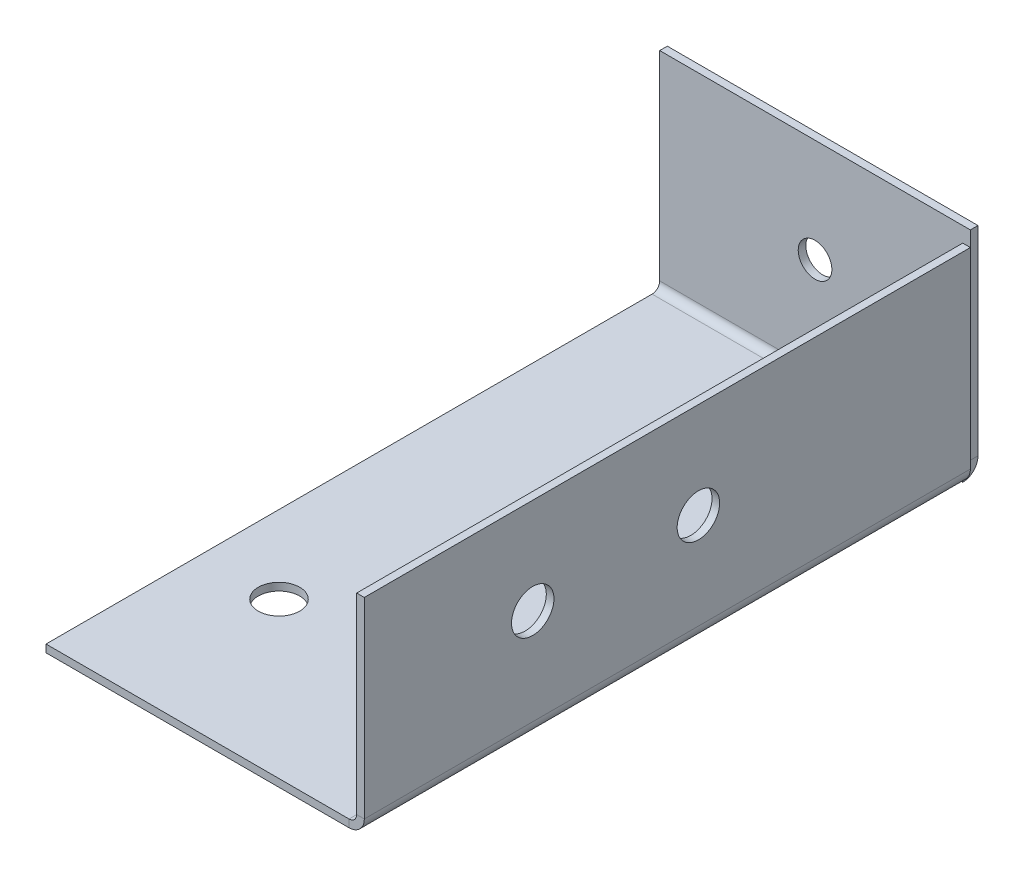
ISO-10303-21;
HEADER;
FILE_DESCRIPTION(('STEP AP214'),'2;1');
FILE_NAME('part.step','',(''),(''),'','','');
FILE_SCHEMA(('AUTOMOTIVE_DESIGN { 1 0 10303 214 1 1 1 1 }'));
ENDSEC;
DATA;
#1=APPLICATION_CONTEXT('core data for automotive mechanical design processes');
#2=APPLICATION_PROTOCOL_DEFINITION('international standard','automotive_design',2000,#1);
#3=PRODUCT_CONTEXT('',#1,'mechanical');
#4=PRODUCT('Part','Part','',(#3));
#5=PRODUCT_RELATED_PRODUCT_CATEGORY('part','',(#4));
#6=PRODUCT_DEFINITION_FORMATION('','',#4);
#7=PRODUCT_DEFINITION_CONTEXT('part definition',#1,'design');
#8=PRODUCT_DEFINITION('design','',#6,#7);
#9=PRODUCT_DEFINITION_SHAPE('','',#8);
#10=(LENGTH_UNIT() NAMED_UNIT(*) SI_UNIT(.MILLI.,.METRE.));
#11=(NAMED_UNIT(*) PLANE_ANGLE_UNIT() SI_UNIT($,.RADIAN.));
#12=(NAMED_UNIT(*) SI_UNIT($,.STERADIAN.) SOLID_ANGLE_UNIT());
#13=UNCERTAINTY_MEASURE_WITH_UNIT(LENGTH_MEASURE(1.E-05),#10,'distance_accuracy_value','');
#14=(GEOMETRIC_REPRESENTATION_CONTEXT(3) GLOBAL_UNCERTAINTY_ASSIGNED_CONTEXT((#13)) GLOBAL_UNIT_ASSIGNED_CONTEXT((#10,
#11,#12)) REPRESENTATION_CONTEXT('',''));
#15=CARTESIAN_POINT('',(0.,0.,0.));
#16=DIRECTION('',(0.,0.,1.));
#17=DIRECTION('',(1.,0.,0.));
#18=AXIS2_PLACEMENT_3D('',#15,#16,#17);
#19=CARTESIAN_POINT('',(15.,0.,-28.5268));
#20=DIRECTION('',(0.,0.,1.));
#21=DIRECTION('',(0.,-1.,0.));
#22=AXIS2_PLACEMENT_3D('',#19,#20,#21);
#23=PLANE('',#22);
#24=DIRECTION('',(0.,-1.,0.));
#25=VECTOR('',#24,1.);
#26=CARTESIAN_POINT('',(15.,0.,-28.5268));
#27=LINE('',#26,#25);
#28=CARTESIAN_POINT('',(15.,-0.539228624855247,-28.5268));
#29=VERTEX_POINT('',#28);
#30=CARTESIAN_POINT('',(15.,-0.736600000000009,-28.5268));
#31=VERTEX_POINT('',#30);
#32=EDGE_CURVE('E78',#29,#31,#27,.T.);
#33=ORIENTED_EDGE('',*,*,#32,.F.);
#34=CARTESIAN_POINT('',(14.2634,0.736599999999986,-28.5268));
#35=DIRECTION('',(0.,0.,-1.));
#36=DIRECTION('',(0.,1.,0.));
#37=AXIS2_PLACEMENT_3D('',#34,#35,#36);
#38=CIRCLE('',#37,1.4732);
#39=CARTESIAN_POINT('',(14.2634,-0.736600000000009,-28.5268));
#40=VERTEX_POINT('',#39);
#41=EDGE_CURVE('E13',#29,#40,#38,.T.);
#42=ORIENTED_EDGE('',*,*,#41,.T.);
#43=DIRECTION('',(-1.,0.,0.));
#44=VECTOR('',#43,1.);
#45=CARTESIAN_POINT('',(-15.,-0.736600000000011,-28.5268));
#46=LINE('',#45,#44);
#47=EDGE_CURVE('E228',#31,#40,#46,.T.);
#48=ORIENTED_EDGE('',*,*,#47,.F.);
#49=EDGE_LOOP('',(#33,#42,#48));
#50=FACE_BOUND('',#49,.T.);
#51=ADVANCED_FACE('F61',(#50),#23,.T.);
#52=CARTESIAN_POINT('',(0.,-0.7366,0.));
#53=DIRECTION('',(0.,-1.,0.));
#54=DIRECTION('',(0.,0.,-1.));
#55=AXIS2_PLACEMENT_3D('',#52,#53,#54);
#56=PLANE('',#55);
#57=CARTESIAN_POINT('',(-7.5,-0.7366,15.));
#58=DIRECTION('',(0.,1.,0.));
#59=DIRECTION('',(0.,0.,1.));
#60=AXIS2_PLACEMENT_3D('',#57,#58,#59);
#61=CIRCLE('',#60,2.);
#62=CARTESIAN_POINT('',(-7.5,-0.7366,17.));
#63=VERTEX_POINT('',#62);
#64=EDGE_CURVE('E290',#63,#63,#61,.T.);
#65=ORIENTED_EDGE('',*,*,#64,.T.);
#66=EDGE_LOOP('',(#65));
#67=FACE_BOUND('',#66,.T.);
#68=CARTESIAN_POINT('',(0.,-0.7366,-15.));
#69=DIRECTION('',(0.,1.,0.));
#70=DIRECTION('',(0.,0.,1.));
#71=AXIS2_PLACEMENT_3D('',#68,#69,#70);
#72=CIRCLE('',#71,2.00000000000001);
#73=CARTESIAN_POINT('',(0.,-0.7366,-13.));
#74=VERTEX_POINT('',#73);
#75=EDGE_CURVE('E296',#74,#74,#72,.T.);
#76=ORIENTED_EDGE('',*,*,#75,.T.);
#77=EDGE_LOOP('',(#76));
#78=FACE_BOUND('',#77,.T.);
#79=CARTESIAN_POINT('',(7.5,-0.7366,15.));
#80=DIRECTION('',(0.,1.,0.));
#81=DIRECTION('',(0.,0.,1.));
#82=AXIS2_PLACEMENT_3D('',#79,#80,#81);
#83=CIRCLE('',#82,2.);
#84=CARTESIAN_POINT('',(7.5,-0.7366,17.));
#85=VERTEX_POINT('',#84);
#86=EDGE_CURVE('E302',#85,#85,#83,.T.);
#87=ORIENTED_EDGE('',*,*,#86,.T.);
#88=EDGE_LOOP('',(#87));
#89=FACE_BOUND('',#88,.T.);
#90=DIRECTION('',(-1.,0.,0.));
#91=VECTOR('',#90,1.);
#92=CARTESIAN_POINT('',(-15.,-0.736600000000011,-28.5268));
#93=LINE('',#92,#91);
#94=CARTESIAN_POINT('',(-15.,-0.736600000000011,-28.5268));
#95=VERTEX_POINT('',#94);
#96=EDGE_CURVE('E269',#95,#40,#93,.F.);
#97=ORIENTED_EDGE('',*,*,#96,.T.);
#98=DIRECTION('',(0.,0.,-1.));
#99=VECTOR('',#98,1.);
#100=CARTESIAN_POINT('',(14.2634,-0.736600000000009,-28.5268));
#101=LINE('',#100,#99);
#102=CARTESIAN_POINT('',(14.2634,-0.7366,30.));
#103=VERTEX_POINT('',#102);
#104=EDGE_CURVE('E172',#40,#103,#101,.F.);
#105=ORIENTED_EDGE('',*,*,#104,.T.);
#106=DIRECTION('',(1.,0.,0.));
#107=VECTOR('',#106,1.);
#108=CARTESIAN_POINT('',(-15.,-0.7366,30.));
#109=LINE('',#108,#107);
#110=CARTESIAN_POINT('',(-15.,-0.7366,30.));
#111=VERTEX_POINT('',#110);
#112=EDGE_CURVE('E309',#111,#103,#109,.T.);
#113=ORIENTED_EDGE('',*,*,#112,.F.);
#114=DIRECTION('',(0.,0.,1.));
#115=VECTOR('',#114,1.);
#116=CARTESIAN_POINT('',(-15.,-0.7366,30.));
#117=LINE('',#116,#115);
#118=EDGE_CURVE('E87',#95,#111,#117,.T.);
#119=ORIENTED_EDGE('',*,*,#118,.F.);
#120=EDGE_LOOP('',(#97,#105,#113,#119));
#121=FACE_BOUND('',#120,.T.);
#122=ADVANCED_FACE('F362',(#67,#78,#89,#121),#56,.T.);
#123=CARTESIAN_POINT('',(0.,0.,0.));
#124=DIRECTION('',(0.,-1.,0.));
#125=DIRECTION('',(0.,0.,-1.));
#126=AXIS2_PLACEMENT_3D('',#123,#124,#125);
#127=PLANE('',#126);
#128=CARTESIAN_POINT('',(-7.5,0.,15.));
#129=DIRECTION('',(0.,1.,0.));
#130=DIRECTION('',(0.,0.,1.));
#131=AXIS2_PLACEMENT_3D('',#128,#129,#130);
#132=CIRCLE('',#131,2.);
#133=CARTESIAN_POINT('',(-7.5,0.,17.));
#134=VERTEX_POINT('',#133);
#135=EDGE_CURVE('E288',#134,#134,#132,.T.);
#136=ORIENTED_EDGE('',*,*,#135,.F.);
#137=EDGE_LOOP('',(#136));
#138=FACE_BOUND('',#137,.T.);
#139=CARTESIAN_POINT('',(0.,0.,-15.));
#140=DIRECTION('',(0.,1.,0.));
#141=DIRECTION('',(0.,0.,1.));
#142=AXIS2_PLACEMENT_3D('',#139,#140,#141);
#143=CIRCLE('',#142,2.00000000000001);
#144=CARTESIAN_POINT('',(0.,0.,-13.));
#145=VERTEX_POINT('',#144);
#146=EDGE_CURVE('E293',#145,#145,#143,.T.);
#147=ORIENTED_EDGE('',*,*,#146,.F.);
#148=EDGE_LOOP('',(#147));
#149=FACE_BOUND('',#148,.T.);
#150=CARTESIAN_POINT('',(7.5,0.,15.));
#151=DIRECTION('',(0.,1.,0.));
#152=DIRECTION('',(0.,0.,1.));
#153=AXIS2_PLACEMENT_3D('',#150,#151,#152);
#154=CIRCLE('',#153,2.);
#155=CARTESIAN_POINT('',(7.5,0.,17.));
#156=VERTEX_POINT('',#155);
#157=EDGE_CURVE('E299',#156,#156,#154,.T.);
#158=ORIENTED_EDGE('',*,*,#157,.F.);
#159=EDGE_LOOP('',(#158));
#160=FACE_BOUND('',#159,.T.);
#161=DIRECTION('',(0.,0.,-1.));
#162=VECTOR('',#161,1.);
#163=CARTESIAN_POINT('',(14.2634,0.,-28.5268));
#164=LINE('',#163,#162);
#165=CARTESIAN_POINT('',(14.2634,0.,-28.5268));
#166=VERTEX_POINT('',#165);
#167=CARTESIAN_POINT('',(14.2634,0.,30.));
#168=VERTEX_POINT('',#167);
#169=EDGE_CURVE('E220',#166,#168,#164,.F.);
#170=ORIENTED_EDGE('',*,*,#169,.F.);
#171=DIRECTION('',(-1.,0.,0.));
#172=VECTOR('',#171,1.);
#173=CARTESIAN_POINT('',(-15.,0.,-28.5268));
#174=LINE('',#173,#172);
#175=CARTESIAN_POINT('',(-15.,0.,-28.5268));
#176=VERTEX_POINT('',#175);
#177=EDGE_CURVE('E282',#176,#166,#174,.F.);
#178=ORIENTED_EDGE('',*,*,#177,.F.);
#179=DIRECTION('',(0.,0.,1.));
#180=VECTOR('',#179,1.);
#181=CARTESIAN_POINT('',(-15.,0.,30.));
#182=LINE('',#181,#180);
#183=CARTESIAN_POINT('',(-15.,0.,30.));
#184=VERTEX_POINT('',#183);
#185=EDGE_CURVE('E305',#176,#184,#182,.T.);
#186=ORIENTED_EDGE('',*,*,#185,.T.);
#187=DIRECTION('',(1.,0.,0.));
#188=VECTOR('',#187,1.);
#189=CARTESIAN_POINT('',(-15.,0.,30.));
#190=LINE('',#189,#188);
#191=EDGE_CURVE('E310',#184,#168,#190,.T.);
#192=ORIENTED_EDGE('',*,*,#191,.T.);
#193=EDGE_LOOP('',(#170,#178,#186,#192));
#194=FACE_BOUND('',#193,.T.);
#195=ADVANCED_FACE('F367',(#138,#149,#160,#194),#127,.F.);
#196=CARTESIAN_POINT('',(-15.,-0.7366,30.));
#197=DIRECTION('',(-1.,0.,0.));
#198=DIRECTION('',(0.,0.,1.));
#199=AXIS2_PLACEMENT_3D('',#196,#197,#198);
#200=PLANE('',#199);
#201=ORIENTED_EDGE('',*,*,#185,.F.);
#202=DIRECTION('',(0.,-1.,0.));
#203=VECTOR('',#202,1.);
#204=CARTESIAN_POINT('',(-15.,0.,-28.5268));
#205=LINE('',#204,#203);
#206=EDGE_CURVE('E276',#176,#95,#205,.T.);
#207=ORIENTED_EDGE('',*,*,#206,.T.);
#208=ORIENTED_EDGE('',*,*,#118,.T.);
#209=DIRECTION('',(0.,1.,0.));
#210=VECTOR('',#209,1.);
#211=CARTESIAN_POINT('',(-15.,-0.7366,30.));
#212=LINE('',#211,#210);
#213=EDGE_CURVE('E70',#111,#184,#212,.T.);
#214=ORIENTED_EDGE('',*,*,#213,.T.);
#215=EDGE_LOOP('',(#201,#207,#208,#214));
#216=FACE_BOUND('',#215,.T.);
#217=ADVANCED_FACE('F63',(#216),#200,.T.);
#218=CARTESIAN_POINT('',(-15.,-0.7366,30.));
#219=DIRECTION('',(0.,0.,1.));
#220=DIRECTION('',(1.,0.,0.));
#221=AXIS2_PLACEMENT_3D('',#218,#219,#220);
#222=PLANE('',#221);
#223=DIRECTION('',(0.,-1.,0.));
#224=VECTOR('',#223,1.);
#225=CARTESIAN_POINT('',(14.2634,0.,30.));
#226=LINE('',#225,#224);
#227=EDGE_CURVE('E216',#168,#103,#226,.T.);
#228=ORIENTED_EDGE('',*,*,#227,.F.);
#229=ORIENTED_EDGE('',*,*,#191,.F.);
#230=ORIENTED_EDGE('',*,*,#213,.F.);
#231=ORIENTED_EDGE('',*,*,#112,.T.);
#232=EDGE_LOOP('',(#228,#229,#230,#231));
#233=FACE_BOUND('',#232,.T.);
#234=ADVANCED_FACE('F423',(#233),#222,.T.);
#235=CARTESIAN_POINT('',(7.5,-0.7366,15.));
#236=DIRECTION('',(0.,1.,0.));
#237=DIRECTION('',(0.,0.,1.));
#238=AXIS2_PLACEMENT_3D('',#235,#236,#237);
#239=CYLINDRICAL_SURFACE('',#238,2.);
#240=ORIENTED_EDGE('',*,*,#86,.F.);
#241=EDGE_LOOP('',(#240));
#242=FACE_BOUND('',#241,.T.);
#243=ORIENTED_EDGE('',*,*,#157,.T.);
#244=EDGE_LOOP('',(#243));
#245=FACE_BOUND('',#244,.T.);
#246=ADVANCED_FACE('F420',(#242,#245),#239,.F.);
#247=CARTESIAN_POINT('',(0.,-0.7366,-15.));
#248=DIRECTION('',(0.,1.,0.));
#249=DIRECTION('',(0.,0.,1.));
#250=AXIS2_PLACEMENT_3D('',#247,#248,#249);
#251=CYLINDRICAL_SURFACE('',#250,2.00000000000001);
#252=ORIENTED_EDGE('',*,*,#75,.F.);
#253=EDGE_LOOP('',(#252));
#254=FACE_BOUND('',#253,.T.);
#255=ORIENTED_EDGE('',*,*,#146,.T.);
#256=EDGE_LOOP('',(#255));
#257=FACE_BOUND('',#256,.T.);
#258=ADVANCED_FACE('F416',(#254,#257),#251,.F.);
#259=CARTESIAN_POINT('',(-7.5,-0.7366,15.));
#260=DIRECTION('',(0.,1.,0.));
#261=DIRECTION('',(0.,0.,1.));
#262=AXIS2_PLACEMENT_3D('',#259,#260,#261);
#263=CYLINDRICAL_SURFACE('',#262,2.);
#264=ORIENTED_EDGE('',*,*,#64,.F.);
#265=EDGE_LOOP('',(#264));
#266=FACE_BOUND('',#265,.T.);
#267=ORIENTED_EDGE('',*,*,#135,.T.);
#268=EDGE_LOOP('',(#267));
#269=FACE_BOUND('',#268,.T.);
#270=ADVANCED_FACE('F409',(#266,#269),#263,.F.);
#271=CARTESIAN_POINT('',(15.,0.736599999999991,-28.5268));
#272=DIRECTION('',(1.,0.,0.));
#273=DIRECTION('',(0.,1.,0.));
#274=AXIS2_PLACEMENT_3D('',#271,#272,#273);
#275=PLANE('',#274);
#276=DIRECTION('',(0.,0.,1.));
#277=VECTOR('',#276,1.);
#278=CARTESIAN_POINT('',(15.,0.736600000000002,-30.));
#279=LINE('',#278,#277);
#280=CARTESIAN_POINT('',(15.,0.736599999999988,-29.2634));
#281=VERTEX_POINT('',#280);
#282=CARTESIAN_POINT('',(15.,0.736599999999986,-30.));
#283=VERTEX_POINT('',#282);
#284=EDGE_CURVE('E231',#281,#283,#279,.F.);
#285=ORIENTED_EDGE('',*,*,#284,.F.);
#286=CARTESIAN_POINT('',(15.,0.736599999999991,-28.5268));
#287=DIRECTION('',(-1.,0.,0.));
#288=DIRECTION('',(0.,-1.,0.));
#289=AXIS2_PLACEMENT_3D('',#286,#287,#288);
#290=CIRCLE('',#289,0.7366);
#291=CARTESIAN_POINT('',(15.,0.,-28.5268));
#292=VERTEX_POINT('',#291);
#293=EDGE_CURVE('E279',#292,#281,#290,.F.);
#294=ORIENTED_EDGE('',*,*,#293,.F.);
#295=EDGE_CURVE('E286',#292,#29,#27,.T.);
#296=ORIENTED_EDGE('',*,*,#295,.T.);
#297=ORIENTED_EDGE('',*,*,#32,.T.);
#298=CARTESIAN_POINT('',(15.,0.736599999999991,-28.5268));
#299=DIRECTION('',(-1.,0.,0.));
#300=DIRECTION('',(0.,-1.,0.));
#301=AXIS2_PLACEMENT_3D('',#298,#299,#300);
#302=CIRCLE('',#301,1.4732);
#303=EDGE_CURVE('E272',#31,#283,#302,.F.);
#304=ORIENTED_EDGE('',*,*,#303,.T.);
#305=EDGE_LOOP('',(#285,#294,#296,#297,#304));
#306=FACE_BOUND('',#305,.T.);
#307=ADVANCED_FACE('F406',(#306),#275,.T.);
#308=CARTESIAN_POINT('',(-15.,0.736599999999989,-28.5268));
#309=DIRECTION('',(1.,0.,0.));
#310=DIRECTION('',(0.,1.,0.));
#311=AXIS2_PLACEMENT_3D('',#308,#309,#310);
#312=PLANE('',#311);
#313=CARTESIAN_POINT('',(-15.,0.736599999999989,-28.5268));
#314=DIRECTION('',(-1.,0.,0.));
#315=DIRECTION('',(0.,-1.,0.));
#316=AXIS2_PLACEMENT_3D('',#313,#314,#315);
#317=CIRCLE('',#316,0.7366);
#318=CARTESIAN_POINT('',(-15.,0.736599999999986,-29.2634));
#319=VERTEX_POINT('',#318);
#320=EDGE_CURVE('E235',#319,#176,#317,.T.);
#321=ORIENTED_EDGE('',*,*,#320,.F.);
#322=DIRECTION('',(0.,0.,1.));
#323=VECTOR('',#322,1.);
#324=CARTESIAN_POINT('',(-15.,0.736599999999993,-29.2634));
#325=LINE('',#324,#323);
#326=CARTESIAN_POINT('',(-15.,0.736599999999999,-30.));
#327=VERTEX_POINT('',#326);
#328=EDGE_CURVE('E262',#319,#327,#325,.F.);
#329=ORIENTED_EDGE('',*,*,#328,.T.);
#330=CARTESIAN_POINT('',(-15.,0.736599999999989,-28.5268));
#331=DIRECTION('',(-1.,0.,0.));
#332=DIRECTION('',(0.,-1.,0.));
#333=AXIS2_PLACEMENT_3D('',#330,#331,#332);
#334=CIRCLE('',#333,1.4732);
#335=EDGE_CURVE('E273',#327,#95,#334,.T.);
#336=ORIENTED_EDGE('',*,*,#335,.T.);
#337=ORIENTED_EDGE('',*,*,#206,.F.);
#338=EDGE_LOOP('',(#321,#329,#336,#337));
#339=FACE_BOUND('',#338,.T.);
#340=ADVANCED_FACE('F401',(#339),#312,.F.);
#341=CARTESIAN_POINT('',(-15.,0.736599999999989,-28.5268));
#342=DIRECTION('',(-1.,0.,0.));
#343=DIRECTION('',(0.,0.,-1.));
#344=AXIS2_PLACEMENT_3D('',#341,#342,#343);
#345=CYLINDRICAL_SURFACE('',#344,1.4732);
#346=ORIENTED_EDGE('',*,*,#96,.F.);
#347=ORIENTED_EDGE('',*,*,#335,.F.);
#348=DIRECTION('',(-1.,0.,0.));
#349=VECTOR('',#348,1.);
#350=CARTESIAN_POINT('',(0.,0.7366,-30.));
#351=LINE('',#350,#349);
#352=EDGE_CURVE('E259',#283,#327,#351,.T.);
#353=ORIENTED_EDGE('',*,*,#352,.F.);
#354=ORIENTED_EDGE('',*,*,#303,.F.);
#355=ORIENTED_EDGE('',*,*,#47,.T.);
#356=EDGE_LOOP('',(#346,#347,#353,#354,#355));
#357=FACE_BOUND('',#356,.T.);
#358=ADVANCED_FACE('F398',(#357),#345,.T.);
#359=CARTESIAN_POINT('',(-15.,0.736599999999989,-28.5268));
#360=DIRECTION('',(-1.,0.,0.));
#361=DIRECTION('',(0.,0.,-1.));
#362=AXIS2_PLACEMENT_3D('',#359,#360,#361);
#363=CYLINDRICAL_SURFACE('',#362,0.7366);
#364=ORIENTED_EDGE('',*,*,#177,.T.);
#365=DIRECTION('',(-1.,0.,0.));
#366=VECTOR('',#365,1.);
#367=CARTESIAN_POINT('',(15.,0.,-28.5268));
#368=LINE('',#367,#366);
#369=EDGE_CURVE('E226',#292,#166,#368,.T.);
#370=ORIENTED_EDGE('',*,*,#369,.F.);
#371=ORIENTED_EDGE('',*,*,#293,.T.);
#372=DIRECTION('',(1.,0.,0.));
#373=VECTOR('',#372,1.);
#374=CARTESIAN_POINT('',(15.,0.736599999999997,-29.2634));
#375=LINE('',#374,#373);
#376=EDGE_CURVE('E265',#281,#319,#375,.F.);
#377=ORIENTED_EDGE('',*,*,#376,.T.);
#378=ORIENTED_EDGE('',*,*,#320,.T.);
#379=EDGE_LOOP('',(#364,#370,#371,#377,#378));
#380=FACE_BOUND('',#379,.T.);
#381=ADVANCED_FACE('F382',(#380),#363,.F.);
#382=CARTESIAN_POINT('',(0.,-1.066552337128E-13,-30.));
#383=DIRECTION('',(0.,0.,-1.));
#384=DIRECTION('',(0.,1.,0.));
#385=AXIS2_PLACEMENT_3D('',#382,#383,#384);
#386=PLANE('',#385);
#387=CARTESIAN_POINT('',(0.,10.,-30.));
#388=DIRECTION('',(0.,0.,-1.));
#389=DIRECTION('',(0.,1.,0.));
#390=AXIS2_PLACEMENT_3D('',#387,#388,#389);
#391=CIRCLE('',#390,1.625);
#392=CARTESIAN_POINT('',(0.,11.625,-30.));
#393=VERTEX_POINT('',#392);
#394=EDGE_CURVE('E253',#393,#393,#391,.T.);
#395=ORIENTED_EDGE('',*,*,#394,.F.);
#396=EDGE_LOOP('',(#395));
#397=FACE_BOUND('',#396,.T.);
#398=DIRECTION('',(0.,1.,0.));
#399=VECTOR('',#398,1.);
#400=CARTESIAN_POINT('',(15.,-1.066552337128E-13,-30.));
#401=LINE('',#400,#399);
#402=CARTESIAN_POINT('',(15.,20.,-30.0000000000001));
#403=VERTEX_POINT('',#402);
#404=EDGE_CURVE('E243',#403,#283,#401,.F.);
#405=ORIENTED_EDGE('',*,*,#404,.T.);
#406=ORIENTED_EDGE('',*,*,#352,.T.);
#407=DIRECTION('',(0.,-1.,0.));
#408=VECTOR('',#407,1.);
#409=CARTESIAN_POINT('',(-15.,-1.04053148498835E-13,-30.));
#410=LINE('',#409,#408);
#411=CARTESIAN_POINT('',(-15.,20.,-30.0000000000001));
#412=VERTEX_POINT('',#411);
#413=EDGE_CURVE('E241',#327,#412,#410,.F.);
#414=ORIENTED_EDGE('',*,*,#413,.T.);
#415=DIRECTION('',(-1.,0.,0.));
#416=VECTOR('',#415,1.);
#417=CARTESIAN_POINT('',(0.,20.,-30.0000000000001));
#418=LINE('',#417,#416);
#419=EDGE_CURVE('E239',#412,#403,#418,.F.);
#420=ORIENTED_EDGE('',*,*,#419,.T.);
#421=EDGE_LOOP('',(#405,#406,#414,#420));
#422=FACE_BOUND('',#421,.T.);
#423=ADVANCED_FACE('F378',(#397,#422),#386,.T.);
#424=CARTESIAN_POINT('',(0.,-1.04083408558608E-13,-29.2634));
#425=DIRECTION('',(0.,0.,-1.));
#426=DIRECTION('',(0.,1.,0.));
#427=AXIS2_PLACEMENT_3D('',#424,#425,#426);
#428=PLANE('',#427);
#429=CARTESIAN_POINT('',(0.,10.,-29.2634));
#430=DIRECTION('',(0.,0.,-1.));
#431=DIRECTION('',(0.,1.,0.));
#432=AXIS2_PLACEMENT_3D('',#429,#430,#431);
#433=CIRCLE('',#432,1.625);
#434=CARTESIAN_POINT('',(0.,11.625,-29.2634));
#435=VERTEX_POINT('',#434);
#436=EDGE_CURVE('E256',#435,#435,#433,.T.);
#437=ORIENTED_EDGE('',*,*,#436,.T.);
#438=EDGE_LOOP('',(#437));
#439=FACE_BOUND('',#438,.T.);
#440=ORIENTED_EDGE('',*,*,#376,.F.);
#441=DIRECTION('',(0.,-1.,0.));
#442=VECTOR('',#441,1.);
#443=CARTESIAN_POINT('',(15.,0.,-29.2634));
#444=LINE('',#443,#442);
#445=CARTESIAN_POINT('',(15.,20.,-29.2634000000001));
#446=VERTEX_POINT('',#445);
#447=EDGE_CURVE('E250',#446,#281,#444,.T.);
#448=ORIENTED_EDGE('',*,*,#447,.F.);
#449=DIRECTION('',(1.,0.,0.));
#450=VECTOR('',#449,1.);
#451=CARTESIAN_POINT('',(-15.,20.,-29.2634000000001));
#452=LINE('',#451,#450);
#453=CARTESIAN_POINT('',(-15.,20.,-29.2634000000001));
#454=VERTEX_POINT('',#453);
#455=EDGE_CURVE('E246',#454,#446,#452,.T.);
#456=ORIENTED_EDGE('',*,*,#455,.F.);
#457=DIRECTION('',(0.,1.,0.));
#458=VECTOR('',#457,1.);
#459=CARTESIAN_POINT('',(-15.,20.,-29.2634000000001));
#460=LINE('',#459,#458);
#461=EDGE_CURVE('E248',#319,#454,#460,.T.);
#462=ORIENTED_EDGE('',*,*,#461,.F.);
#463=EDGE_LOOP('',(#440,#448,#456,#462));
#464=FACE_BOUND('',#463,.T.);
#465=ADVANCED_FACE('F381',(#439,#464),#428,.F.);
#466=CARTESIAN_POINT('',(15.,0.,-30.));
#467=DIRECTION('',(-1.,0.,0.));
#468=DIRECTION('',(0.,0.,1.));
#469=AXIS2_PLACEMENT_3D('',#466,#467,#468);
#470=PLANE('',#469);
#471=ORIENTED_EDGE('',*,*,#284,.T.);
#472=ORIENTED_EDGE('',*,*,#404,.F.);
#473=DIRECTION('',(0.,0.,1.));
#474=VECTOR('',#473,1.);
#475=CARTESIAN_POINT('',(15.,20.,-30.0000000000001));
#476=LINE('',#475,#474);
#477=EDGE_CURVE('E236',#403,#446,#476,.T.);
#478=ORIENTED_EDGE('',*,*,#477,.T.);
#479=ORIENTED_EDGE('',*,*,#447,.T.);
#480=EDGE_LOOP('',(#471,#472,#478,#479));
#481=FACE_BOUND('',#480,.T.);
#482=ADVANCED_FACE('F386',(#481),#470,.F.);
#483=CARTESIAN_POINT('',(-15.,20.,-30.0000000000001));
#484=DIRECTION('',(1.,0.,0.));
#485=DIRECTION('',(0.,1.,0.));
#486=AXIS2_PLACEMENT_3D('',#483,#484,#485);
#487=PLANE('',#486);
#488=ORIENTED_EDGE('',*,*,#328,.F.);
#489=ORIENTED_EDGE('',*,*,#461,.T.);
#490=DIRECTION('',(0.,0.,1.));
#491=VECTOR('',#490,1.);
#492=CARTESIAN_POINT('',(-15.,20.,-30.0000000000001));
#493=LINE('',#492,#491);
#494=EDGE_CURVE('E232',#412,#454,#493,.T.);
#495=ORIENTED_EDGE('',*,*,#494,.F.);
#496=ORIENTED_EDGE('',*,*,#413,.F.);
#497=EDGE_LOOP('',(#488,#489,#495,#496));
#498=FACE_BOUND('',#497,.T.);
#499=ADVANCED_FACE('F390',(#498),#487,.F.);
#500=CARTESIAN_POINT('',(-15.,20.,-30.0000000000001));
#501=DIRECTION('',(0.,-1.,0.));
#502=DIRECTION('',(0.,0.,-1.));
#503=AXIS2_PLACEMENT_3D('',#500,#501,#502);
#504=PLANE('',#503);
#505=ORIENTED_EDGE('',*,*,#455,.T.);
#506=ORIENTED_EDGE('',*,*,#477,.F.);
#507=ORIENTED_EDGE('',*,*,#419,.F.);
#508=ORIENTED_EDGE('',*,*,#494,.T.);
#509=EDGE_LOOP('',(#505,#506,#507,#508));
#510=FACE_BOUND('',#509,.T.);
#511=ADVANCED_FACE('F376',(#510),#504,.F.);
#512=CARTESIAN_POINT('',(0.,10.,-30.));
#513=DIRECTION('',(0.,0.,1.));
#514=DIRECTION('',(0.,-1.,0.));
#515=AXIS2_PLACEMENT_3D('',#512,#513,#514);
#516=CYLINDRICAL_SURFACE('',#515,1.625);
#517=ORIENTED_EDGE('',*,*,#394,.T.);
#518=EDGE_LOOP('',(#517));
#519=FACE_BOUND('',#518,.T.);
#520=ORIENTED_EDGE('',*,*,#436,.F.);
#521=EDGE_LOOP('',(#520));
#522=FACE_BOUND('',#521,.T.);
#523=ADVANCED_FACE('F373',(#519,#522),#516,.F.);
#524=CARTESIAN_POINT('',(14.2634,0.736599999999986,-28.5268));
#525=DIRECTION('',(0.,0.,1.));
#526=DIRECTION('',(0.,-1.,0.));
#527=AXIS2_PLACEMENT_3D('',#524,#525,#526);
#528=PLANE('',#527);
#529=ORIENTED_EDGE('',*,*,#295,.F.);
#530=ORIENTED_EDGE('',*,*,#369,.T.);
#531=CARTESIAN_POINT('',(14.2634,0.736599999999986,-28.5268));
#532=DIRECTION('',(0.,0.,-1.));
#533=DIRECTION('',(0.,1.,0.));
#534=AXIS2_PLACEMENT_3D('',#531,#532,#533);
#535=CIRCLE('',#534,0.736599999999995);
#536=CARTESIAN_POINT('',(15.,0.736599999999983,-28.5268));
#537=VERTEX_POINT('',#536);
#538=EDGE_CURVE('E180',#537,#166,#535,.T.);
#539=ORIENTED_EDGE('',*,*,#538,.F.);
#540=DIRECTION('',(1.,0.,0.));
#541=VECTOR('',#540,1.);
#542=CARTESIAN_POINT('',(15.,0.736599999999983,-28.5268));
#543=LINE('',#542,#541);
#544=CARTESIAN_POINT('',(15.7366,0.73659999999998,-28.5268));
#545=VERTEX_POINT('',#544);
#546=EDGE_CURVE('E176',#537,#545,#543,.T.);
#547=ORIENTED_EDGE('',*,*,#546,.T.);
#548=EDGE_CURVE('E72',#545,#29,#38,.T.);
#549=ORIENTED_EDGE('',*,*,#548,.T.);
#550=EDGE_LOOP('',(#529,#530,#539,#547,#549));
#551=FACE_BOUND('',#550,.T.);
#552=ADVANCED_FACE('F177',(#551),#528,.F.);
#553=CARTESIAN_POINT('',(14.2634,0.736599999999999,30.));
#554=DIRECTION('',(0.,0.,1.));
#555=DIRECTION('',(0.,-1.,0.));
#556=AXIS2_PLACEMENT_3D('',#553,#554,#555);
#557=PLANE('',#556);
#558=DIRECTION('',(1.,0.,0.));
#559=VECTOR('',#558,1.);
#560=CARTESIAN_POINT('',(15.,0.736599999999997,30.));
#561=LINE('',#560,#559);
#562=CARTESIAN_POINT('',(15.,0.736599999999996,30.));
#563=VERTEX_POINT('',#562);
#564=CARTESIAN_POINT('',(15.7366,0.736599999999994,30.));
#565=VERTEX_POINT('',#564);
#566=EDGE_CURVE('E323',#563,#565,#561,.T.);
#567=ORIENTED_EDGE('',*,*,#566,.F.);
#568=CARTESIAN_POINT('',(14.2634,0.736599999999999,30.));
#569=DIRECTION('',(0.,0.,-1.));
#570=DIRECTION('',(0.,1.,0.));
#571=AXIS2_PLACEMENT_3D('',#568,#569,#570);
#572=CIRCLE('',#571,0.736599999999995);
#573=EDGE_CURVE('E173',#168,#563,#572,.F.);
#574=ORIENTED_EDGE('',*,*,#573,.F.);
#575=ORIENTED_EDGE('',*,*,#227,.T.);
#576=CARTESIAN_POINT('',(14.2634,0.736599999999999,30.));
#577=DIRECTION('',(0.,0.,-1.));
#578=DIRECTION('',(0.,1.,0.));
#579=AXIS2_PLACEMENT_3D('',#576,#577,#578);
#580=CIRCLE('',#579,1.4732);
#581=EDGE_CURVE('E215',#103,#565,#580,.F.);
#582=ORIENTED_EDGE('',*,*,#581,.T.);
#583=EDGE_LOOP('',(#567,#574,#575,#582));
#584=FACE_BOUND('',#583,.T.);
#585=ADVANCED_FACE('F338',(#584),#557,.T.);
#586=CARTESIAN_POINT('',(14.2634,0.736599999999986,-28.5268));
#587=DIRECTION('',(0.,0.,-1.));
#588=DIRECTION('',(1.,0.,0.));
#589=AXIS2_PLACEMENT_3D('',#586,#587,#588);
#590=CYLINDRICAL_SURFACE('',#589,1.4732);
#591=ORIENTED_EDGE('',*,*,#104,.F.);
#592=ORIENTED_EDGE('',*,*,#41,.F.);
#593=ORIENTED_EDGE('',*,*,#548,.F.);
#594=DIRECTION('',(0.,0.,1.));
#595=VECTOR('',#594,1.);
#596=CARTESIAN_POINT('',(15.7366,0.736599999999987,0.));
#597=LINE('',#596,#595);
#598=EDGE_CURVE('E168',#545,#565,#597,.T.);
#599=ORIENTED_EDGE('',*,*,#598,.T.);
#600=ORIENTED_EDGE('',*,*,#581,.F.);
#601=EDGE_LOOP('',(#591,#592,#593,#599,#600));
#602=FACE_BOUND('',#601,.T.);
#603=ADVANCED_FACE('F165',(#602),#590,.T.);
#604=CARTESIAN_POINT('',(14.2634,0.736599999999986,-28.5268));
#605=DIRECTION('',(0.,0.,-1.));
#606=DIRECTION('',(1.,0.,0.));
#607=AXIS2_PLACEMENT_3D('',#604,#605,#606);
#608=CYLINDRICAL_SURFACE('',#607,0.736599999999995);
#609=ORIENTED_EDGE('',*,*,#169,.T.);
#610=ORIENTED_EDGE('',*,*,#573,.T.);
#611=DIRECTION('',(0.,0.,-1.));
#612=VECTOR('',#611,1.);
#613=CARTESIAN_POINT('',(15.,0.736599999999997,30.));
#614=LINE('',#613,#612);
#615=EDGE_CURVE('E184',#563,#537,#614,.T.);
#616=ORIENTED_EDGE('',*,*,#615,.T.);
#617=ORIENTED_EDGE('',*,*,#538,.T.);
#618=EDGE_LOOP('',(#609,#610,#616,#617));
#619=FACE_BOUND('',#618,.T.);
#620=ADVANCED_FACE('F341',(#619),#608,.F.);
#621=CARTESIAN_POINT('',(15.7366,0.,30.));
#622=DIRECTION('',(0.,0.,-1.));
#623=DIRECTION('',(0.,1.,0.));
#624=AXIS2_PLACEMENT_3D('',#621,#622,#623);
#625=PLANE('',#624);
#626=ORIENTED_EDGE('',*,*,#566,.T.);
#627=DIRECTION('',(0.,-1.,0.));
#628=VECTOR('',#627,1.);
#629=CARTESIAN_POINT('',(15.7366,0.,30.));
#630=LINE('',#629,#628);
#631=CARTESIAN_POINT('',(15.7366000000001,19.2634,30.));
#632=VERTEX_POINT('',#631);
#633=EDGE_CURVE('E192',#632,#565,#630,.T.);
#634=ORIENTED_EDGE('',*,*,#633,.F.);
#635=DIRECTION('',(-1.,0.,0.));
#636=VECTOR('',#635,1.);
#637=CARTESIAN_POINT('',(15.7366000000001,19.2634,30.));
#638=LINE('',#637,#636);
#639=CARTESIAN_POINT('',(15.0000000000001,19.2634,30.));
#640=VERTEX_POINT('',#639);
#641=EDGE_CURVE('E201',#632,#640,#638,.T.);
#642=ORIENTED_EDGE('',*,*,#641,.T.);
#643=DIRECTION('',(0.,-1.,0.));
#644=VECTOR('',#643,1.);
#645=CARTESIAN_POINT('',(15.,0.,30.));
#646=LINE('',#645,#644);
#647=EDGE_CURVE('E193',#640,#563,#646,.T.);
#648=ORIENTED_EDGE('',*,*,#647,.T.);
#649=EDGE_LOOP('',(#626,#634,#642,#648));
#650=FACE_BOUND('',#649,.T.);
#651=ADVANCED_FACE('F334',(#650),#625,.F.);
#652=CARTESIAN_POINT('',(15.7366000000001,19.2634,-28.5268));
#653=DIRECTION('',(0.,0.,1.));
#654=DIRECTION('',(0.,-1.,0.));
#655=AXIS2_PLACEMENT_3D('',#652,#653,#654);
#656=PLANE('',#655);
#657=ORIENTED_EDGE('',*,*,#546,.F.);
#658=DIRECTION('',(0.,1.,0.));
#659=VECTOR('',#658,1.);
#660=CARTESIAN_POINT('',(15.0000000000001,19.2634,-28.5268));
#661=LINE('',#660,#659);
#662=CARTESIAN_POINT('',(15.0000000000001,19.2634,-28.5268));
#663=VERTEX_POINT('',#662);
#664=EDGE_CURVE('E208',#537,#663,#661,.T.);
#665=ORIENTED_EDGE('',*,*,#664,.T.);
#666=DIRECTION('',(-1.,0.,0.));
#667=VECTOR('',#666,1.);
#668=CARTESIAN_POINT('',(15.7366000000001,19.2634,-28.5268));
#669=LINE('',#668,#667);
#670=CARTESIAN_POINT('',(15.7366000000001,19.2634,-28.5268));
#671=VERTEX_POINT('',#670);
#672=EDGE_CURVE('E197',#671,#663,#669,.T.);
#673=ORIENTED_EDGE('',*,*,#672,.F.);
#674=DIRECTION('',(0.,1.,0.));
#675=VECTOR('',#674,1.);
#676=CARTESIAN_POINT('',(15.7366000000001,19.2634,-28.5268));
#677=LINE('',#676,#675);
#678=EDGE_CURVE('E189',#545,#671,#677,.T.);
#679=ORIENTED_EDGE('',*,*,#678,.F.);
#680=EDGE_LOOP('',(#657,#665,#673,#679));
#681=FACE_BOUND('',#680,.T.);
#682=ADVANCED_FACE('F195',(#681),#656,.F.);
#683=CARTESIAN_POINT('',(15.7366,0.,0.));
#684=DIRECTION('',(-1.,0.,0.));
#685=DIRECTION('',(0.,-1.,0.));
#686=AXIS2_PLACEMENT_3D('',#683,#684,#685);
#687=PLANE('',#686);
#688=CARTESIAN_POINT('',(15.7366,10.000000000001,13.7365999999995));
#689=DIRECTION('',(-1.,0.,0.));
#690=DIRECTION('',(0.,-1.,0.));
#691=AXIS2_PLACEMENT_3D('',#688,#689,#690);
#692=CIRCLE('',#691,2.05);
#693=CARTESIAN_POINT('',(15.7366,10.000000000001,11.6865999999995));
#694=VERTEX_POINT('',#693);
#695=EDGE_CURVE('E319',#694,#694,#692,.T.);
#696=ORIENTED_EDGE('',*,*,#695,.T.);
#697=EDGE_LOOP('',(#696));
#698=FACE_BOUND('',#697,.T.);
#699=CARTESIAN_POINT('',(15.7366,9.99999999999961,-2.26339999999993));
#700=DIRECTION('',(-1.,0.,0.));
#701=DIRECTION('',(0.,-1.,0.));
#702=AXIS2_PLACEMENT_3D('',#699,#700,#701);
#703=CIRCLE('',#702,2.0499999999998);
#704=CARTESIAN_POINT('',(15.7366,9.99999999999961,-4.31339999999973));
#705=VERTEX_POINT('',#704);
#706=EDGE_CURVE('E318',#705,#705,#703,.T.);
#707=ORIENTED_EDGE('',*,*,#706,.T.);
#708=EDGE_LOOP('',(#707));
#709=FACE_BOUND('',#708,.T.);
#710=ORIENTED_EDGE('',*,*,#598,.F.);
#711=ORIENTED_EDGE('',*,*,#678,.T.);
#712=DIRECTION('',(0.,0.,1.));
#713=VECTOR('',#712,1.);
#714=CARTESIAN_POINT('',(15.7366000000001,19.2634,30.));
#715=LINE('',#714,#713);
#716=EDGE_CURVE('E199',#671,#632,#715,.T.);
#717=ORIENTED_EDGE('',*,*,#716,.T.);
#718=ORIENTED_EDGE('',*,*,#633,.T.);
#719=EDGE_LOOP('',(#710,#711,#717,#718));
#720=FACE_BOUND('',#719,.T.);
#721=ADVANCED_FACE('F188',(#698,#709,#720),#687,.F.);
#722=CARTESIAN_POINT('',(15.,0.,0.));
#723=DIRECTION('',(-1.,0.,0.));
#724=DIRECTION('',(0.,-1.,0.));
#725=AXIS2_PLACEMENT_3D('',#722,#723,#724);
#726=PLANE('',#725);
#727=CARTESIAN_POINT('',(15.,10.000000000001,13.7365999999995));
#728=DIRECTION('',(-1.,0.,0.));
#729=DIRECTION('',(0.,-1.,0.));
#730=AXIS2_PLACEMENT_3D('',#727,#728,#729);
#731=CIRCLE('',#730,2.05);
#732=CARTESIAN_POINT('',(15.,10.000000000001,11.6865999999995));
#733=VERTEX_POINT('',#732);
#734=EDGE_CURVE('E65',#733,#733,#731,.T.);
#735=ORIENTED_EDGE('',*,*,#734,.F.);
#736=EDGE_LOOP('',(#735));
#737=FACE_BOUND('',#736,.T.);
#738=CARTESIAN_POINT('',(15.,9.99999999999961,-2.26339999999993));
#739=DIRECTION('',(-1.,0.,0.));
#740=DIRECTION('',(0.,-1.,0.));
#741=AXIS2_PLACEMENT_3D('',#738,#739,#740);
#742=CIRCLE('',#741,2.0499999999998);
#743=CARTESIAN_POINT('',(15.,9.99999999999961,-4.31339999999973));
#744=VERTEX_POINT('',#743);
#745=EDGE_CURVE('E316',#744,#744,#742,.T.);
#746=ORIENTED_EDGE('',*,*,#745,.F.);
#747=EDGE_LOOP('',(#746));
#748=FACE_BOUND('',#747,.T.);
#749=ORIENTED_EDGE('',*,*,#664,.F.);
#750=ORIENTED_EDGE('',*,*,#615,.F.);
#751=ORIENTED_EDGE('',*,*,#647,.F.);
#752=DIRECTION('',(0.,0.,1.));
#753=VECTOR('',#752,1.);
#754=CARTESIAN_POINT('',(15.0000000000001,19.2634,30.));
#755=LINE('',#754,#753);
#756=EDGE_CURVE('E203',#663,#640,#755,.T.);
#757=ORIENTED_EDGE('',*,*,#756,.F.);
#758=EDGE_LOOP('',(#749,#750,#751,#757));
#759=FACE_BOUND('',#758,.T.);
#760=ADVANCED_FACE('F344',(#737,#748,#759),#726,.T.);
#761=CARTESIAN_POINT('',(15.7366000000001,19.2634,30.));
#762=DIRECTION('',(0.,-1.,0.));
#763=DIRECTION('',(1.,0.,0.));
#764=AXIS2_PLACEMENT_3D('',#761,#762,#763);
#765=PLANE('',#764);
#766=ORIENTED_EDGE('',*,*,#756,.T.);
#767=ORIENTED_EDGE('',*,*,#641,.F.);
#768=ORIENTED_EDGE('',*,*,#716,.F.);
#769=ORIENTED_EDGE('',*,*,#672,.T.);
#770=EDGE_LOOP('',(#766,#767,#768,#769));
#771=FACE_BOUND('',#770,.T.);
#772=ADVANCED_FACE('F347',(#771),#765,.F.);
#773=CARTESIAN_POINT('',(-15.0000000000001,9.99999999999961,-2.26340000000003));
#774=DIRECTION('',(1.,0.,0.));
#775=DIRECTION('',(0.,0.,-1.));
#776=AXIS2_PLACEMENT_3D('',#773,#774,#775);
#777=CYLINDRICAL_SURFACE('',#776,2.0499999999998);
#778=CARTESIAN_POINT('',(15.,9.99999999999961,-4.31339999999973));
#779=CARTESIAN_POINT('',(15.0076729166667,9.99999999999961,-4.31339999999973));
#780=CARTESIAN_POINT('',(15.0153458333334,9.99999999999961,-4.31339999999973));
#781=CARTESIAN_POINT('',(15.0306916666667,9.99999999999961,-4.31339999999973));
#782=CARTESIAN_POINT('',(15.0383645833334,9.99999999999961,-4.31339999999973));
#783=CARTESIAN_POINT('',(15.0537104166667,9.99999999999961,-4.31339999999973));
#784=CARTESIAN_POINT('',(15.0613833333334,9.99999999999961,-4.31339999999973));
#785=CARTESIAN_POINT('',(15.0767291666667,9.99999999999961,-4.31339999999973));
#786=CARTESIAN_POINT('',(15.0844020833334,9.99999999999961,-4.31339999999973));
#787=CARTESIAN_POINT('',(15.0997479166667,9.99999999999961,-4.31339999999973));
#788=CARTESIAN_POINT('',(15.1074208333334,9.99999999999961,-4.31339999999973));
#789=CARTESIAN_POINT('',(15.1227666666667,9.99999999999961,-4.31339999999973));
#790=CARTESIAN_POINT('',(15.1304395833334,9.99999999999961,-4.31339999999973));
#791=CARTESIAN_POINT('',(15.1457854166667,9.99999999999961,-4.31339999999973));
#792=CARTESIAN_POINT('',(15.1534583333334,9.99999999999961,-4.31339999999973));
#793=CARTESIAN_POINT('',(15.1688041666667,9.99999999999961,-4.31339999999973));
#794=CARTESIAN_POINT('',(15.1764770833334,9.99999999999961,-4.31339999999973));
#795=CARTESIAN_POINT('',(15.1918229166667,9.99999999999961,-4.31339999999973));
#796=CARTESIAN_POINT('',(15.1994958333334,9.99999999999961,-4.31339999999973));
#797=CARTESIAN_POINT('',(15.2148416666667,9.99999999999961,-4.31339999999973));
#798=CARTESIAN_POINT('',(15.2225145833334,9.99999999999961,-4.31339999999973));
#799=CARTESIAN_POINT('',(15.2378604166667,9.99999999999961,-4.31339999999973));
#800=CARTESIAN_POINT('',(15.2455333333334,9.99999999999961,-4.31339999999973));
#801=CARTESIAN_POINT('',(15.2608791666667,9.99999999999961,-4.31339999999973));
#802=CARTESIAN_POINT('',(15.2685520833334,9.99999999999961,-4.31339999999973));
#803=CARTESIAN_POINT('',(15.2838979166667,9.99999999999961,-4.31339999999973));
#804=CARTESIAN_POINT('',(15.2915708333334,9.99999999999961,-4.31339999999973));
#805=CARTESIAN_POINT('',(15.3069166666667,9.99999999999961,-4.31339999999973));
#806=CARTESIAN_POINT('',(15.3145895833334,9.99999999999961,-4.31339999999973));
#807=CARTESIAN_POINT('',(15.3299354166667,9.99999999999961,-4.31339999999973));
#808=CARTESIAN_POINT('',(15.3376083333334,9.99999999999961,-4.31339999999973));
#809=CARTESIAN_POINT('',(15.3529541666667,9.99999999999961,-4.31339999999973));
#810=CARTESIAN_POINT('',(15.3606270833334,9.99999999999961,-4.31339999999973));
#811=CARTESIAN_POINT('',(15.3759729166667,9.99999999999961,-4.31339999999973));
#812=CARTESIAN_POINT('',(15.3836458333334,9.99999999999961,-4.31339999999973));
#813=CARTESIAN_POINT('',(15.3989916666667,9.99999999999961,-4.31339999999973));
#814=CARTESIAN_POINT('',(15.4066645833334,9.99999999999961,-4.31339999999973));
#815=CARTESIAN_POINT('',(15.4220104166667,9.99999999999961,-4.31339999999973));
#816=CARTESIAN_POINT('',(15.4296833333334,9.99999999999961,-4.31339999999973));
#817=CARTESIAN_POINT('',(15.4450291666667,9.99999999999961,-4.31339999999973));
#818=CARTESIAN_POINT('',(15.4527020833334,9.99999999999961,-4.31339999999973));
#819=CARTESIAN_POINT('',(15.4680479166667,9.99999999999961,-4.31339999999973));
#820=CARTESIAN_POINT('',(15.4757208333334,9.99999999999961,-4.31339999999973));
#821=CARTESIAN_POINT('',(15.4910666666667,9.99999999999961,-4.31339999999973));
#822=CARTESIAN_POINT('',(15.4987395833334,9.99999999999961,-4.31339999999973));
#823=CARTESIAN_POINT('',(15.5140854166667,9.99999999999961,-4.31339999999973));
#824=CARTESIAN_POINT('',(15.5217583333334,9.99999999999961,-4.31339999999973));
#825=CARTESIAN_POINT('',(15.5371041666667,9.99999999999961,-4.31339999999973));
#826=CARTESIAN_POINT('',(15.5447770833334,9.99999999999961,-4.31339999999973));
#827=CARTESIAN_POINT('',(15.5601229166667,9.99999999999961,-4.31339999999973));
#828=CARTESIAN_POINT('',(15.5677958333334,9.99999999999961,-4.31339999999973));
#829=CARTESIAN_POINT('',(15.5831416666667,9.99999999999961,-4.31339999999973));
#830=CARTESIAN_POINT('',(15.5908145833334,9.99999999999961,-4.31339999999973));
#831=CARTESIAN_POINT('',(15.6061604166667,9.99999999999961,-4.31339999999973));
#832=CARTESIAN_POINT('',(15.6138333333334,9.99999999999961,-4.31339999999973));
#833=CARTESIAN_POINT('',(15.6291791666667,9.99999999999961,-4.31339999999973));
#834=CARTESIAN_POINT('',(15.6368520833334,9.99999999999961,-4.31339999999973));
#835=CARTESIAN_POINT('',(15.6521979166667,9.99999999999961,-4.31339999999973));
#836=CARTESIAN_POINT('',(15.6598708333334,9.99999999999961,-4.31339999999973));
#837=CARTESIAN_POINT('',(15.6752166666667,9.99999999999961,-4.31339999999973));
#838=CARTESIAN_POINT('',(15.6828895833334,9.99999999999961,-4.31339999999973));
#839=CARTESIAN_POINT('',(15.6982354166667,9.99999999999961,-4.31339999999973));
#840=CARTESIAN_POINT('',(15.7059083333334,9.99999999999961,-4.31339999999973));
#841=CARTESIAN_POINT('',(15.7212541666667,9.99999999999961,-4.31339999999973));
#842=CARTESIAN_POINT('',(15.7289270833334,9.99999999999961,-4.31339999999973));
#843=CARTESIAN_POINT('',(15.7366,9.99999999999961,-4.31339999999973));
#844=B_SPLINE_CURVE_WITH_KNOTS('',3,(#778,#779,#780,#781,#782,#783,#784,#785,#786,#787,#788,
#789,#790,#791,#792,#793,#794,#795,#796,#797,#798,#799,#800,#801,#802,#803,#804,#805,#806,#807,
#808,#809,#810,#811,#812,#813,#814,#815,#816,#817,#818,#819,#820,#821,#822,#823,#824,#825,#826,
#827,#828,#829,#830,#831,#832,#833,#834,#835,#836,#837,#838,#839,#840,#841,#842,#843),
.UNSPECIFIED.,.F.,.F.,(4,2,2,2,2,2,2,2,2,2,2,2,2,2,2,2,2,2,2,2,2,2,2,2,2,2,2,2,2,2,2,2,4),(0.,
0.0230187499999993,0.0460374999999985,0.0690562500000012,0.0920750000000005,0.11509375,
0.138112500000002,0.161131250000002,0.184150000000001,0.20716875,0.230187499999999,
0.253206250000002,0.276225000000001,0.299243750000001,0.322262500000003,0.345281250000003,
0.368300000000002,0.391318750000001,0.4143375,0.437356250000003,0.460375000000002,
0.483393750000002,0.506412500000004,0.529431250000004,0.552450000000003,0.575468750000002,
0.598487500000001,0.621506250000004,0.644525000000003,0.667543750000003,0.690562500000005,
0.713581250000005,0.736600000000004),.UNSPECIFIED.);
#845=EDGE_CURVE('BSEAM350',#744,#705,#844,.T.);
#846=ORIENTED_EDGE('',*,*,#745,.T.);
#847=ORIENTED_EDGE('',*,*,#706,.F.);
#848=ORIENTED_EDGE('',*,*,#845,.T.);
#849=ORIENTED_EDGE('',*,*,#845,.F.);
#850=EDGE_LOOP('',(#846,#848,#847,#849));
#851=FACE_BOUND('',#850,.T.);
#852=ADVANCED_FACE('F350',(#851),#777,.F.);
#853=CARTESIAN_POINT('',(-15.0000000000002,10.000000000001,13.7365999999994));
#854=DIRECTION('',(1.,0.,0.));
#855=DIRECTION('',(0.,0.,-1.));
#856=AXIS2_PLACEMENT_3D('',#853,#854,#855);
#857=CYLINDRICAL_SURFACE('',#856,2.05);
#858=CARTESIAN_POINT('',(15.,10.000000000001,11.6865999999995));
#859=CARTESIAN_POINT('',(15.0076729166667,10.000000000001,11.6865999999995));
#860=CARTESIAN_POINT('',(15.0153458333334,10.000000000001,11.6865999999995));
#861=CARTESIAN_POINT('',(15.0306916666667,10.000000000001,11.6865999999995));
#862=CARTESIAN_POINT('',(15.0383645833334,10.000000000001,11.6865999999995));
#863=CARTESIAN_POINT('',(15.0537104166667,10.000000000001,11.6865999999995));
#864=CARTESIAN_POINT('',(15.0613833333334,10.000000000001,11.6865999999995));
#865=CARTESIAN_POINT('',(15.0767291666667,10.000000000001,11.6865999999995));
#866=CARTESIAN_POINT('',(15.0844020833334,10.000000000001,11.6865999999995));
#867=CARTESIAN_POINT('',(15.0997479166667,10.000000000001,11.6865999999995));
#868=CARTESIAN_POINT('',(15.1074208333334,10.000000000001,11.6865999999995));
#869=CARTESIAN_POINT('',(15.1227666666667,10.000000000001,11.6865999999995));
#870=CARTESIAN_POINT('',(15.1304395833334,10.000000000001,11.6865999999995));
#871=CARTESIAN_POINT('',(15.1457854166667,10.000000000001,11.6865999999995));
#872=CARTESIAN_POINT('',(15.1534583333334,10.000000000001,11.6865999999995));
#873=CARTESIAN_POINT('',(15.1688041666667,10.000000000001,11.6865999999995));
#874=CARTESIAN_POINT('',(15.1764770833334,10.000000000001,11.6865999999995));
#875=CARTESIAN_POINT('',(15.1918229166667,10.000000000001,11.6865999999995));
#876=CARTESIAN_POINT('',(15.1994958333334,10.000000000001,11.6865999999995));
#877=CARTESIAN_POINT('',(15.2148416666667,10.000000000001,11.6865999999995));
#878=CARTESIAN_POINT('',(15.2225145833334,10.000000000001,11.6865999999995));
#879=CARTESIAN_POINT('',(15.2378604166667,10.000000000001,11.6865999999995));
#880=CARTESIAN_POINT('',(15.2455333333334,10.000000000001,11.6865999999995));
#881=CARTESIAN_POINT('',(15.2608791666667,10.000000000001,11.6865999999995));
#882=CARTESIAN_POINT('',(15.2685520833334,10.000000000001,11.6865999999995));
#883=CARTESIAN_POINT('',(15.2838979166667,10.000000000001,11.6865999999995));
#884=CARTESIAN_POINT('',(15.2915708333334,10.000000000001,11.6865999999995));
#885=CARTESIAN_POINT('',(15.3069166666667,10.000000000001,11.6865999999995));
#886=CARTESIAN_POINT('',(15.3145895833334,10.000000000001,11.6865999999995));
#887=CARTESIAN_POINT('',(15.3299354166667,10.000000000001,11.6865999999995));
#888=CARTESIAN_POINT('',(15.3376083333334,10.000000000001,11.6865999999995));
#889=CARTESIAN_POINT('',(15.3529541666667,10.000000000001,11.6865999999995));
#890=CARTESIAN_POINT('',(15.3606270833334,10.000000000001,11.6865999999995));
#891=CARTESIAN_POINT('',(15.3759729166667,10.000000000001,11.6865999999995));
#892=CARTESIAN_POINT('',(15.3836458333334,10.000000000001,11.6865999999995));
#893=CARTESIAN_POINT('',(15.3989916666667,10.000000000001,11.6865999999995));
#894=CARTESIAN_POINT('',(15.4066645833334,10.000000000001,11.6865999999995));
#895=CARTESIAN_POINT('',(15.4220104166667,10.000000000001,11.6865999999995));
#896=CARTESIAN_POINT('',(15.4296833333334,10.000000000001,11.6865999999995));
#897=CARTESIAN_POINT('',(15.4450291666667,10.000000000001,11.6865999999995));
#898=CARTESIAN_POINT('',(15.4527020833334,10.000000000001,11.6865999999995));
#899=CARTESIAN_POINT('',(15.4680479166667,10.000000000001,11.6865999999995));
#900=CARTESIAN_POINT('',(15.4757208333334,10.000000000001,11.6865999999995));
#901=CARTESIAN_POINT('',(15.4910666666667,10.000000000001,11.6865999999995));
#902=CARTESIAN_POINT('',(15.4987395833334,10.000000000001,11.6865999999995));
#903=CARTESIAN_POINT('',(15.5140854166667,10.000000000001,11.6865999999995));
#904=CARTESIAN_POINT('',(15.5217583333334,10.000000000001,11.6865999999995));
#905=CARTESIAN_POINT('',(15.5371041666667,10.000000000001,11.6865999999995));
#906=CARTESIAN_POINT('',(15.5447770833334,10.000000000001,11.6865999999995));
#907=CARTESIAN_POINT('',(15.5601229166667,10.000000000001,11.6865999999995));
#908=CARTESIAN_POINT('',(15.5677958333334,10.000000000001,11.6865999999995));
#909=CARTESIAN_POINT('',(15.5831416666667,10.000000000001,11.6865999999995));
#910=CARTESIAN_POINT('',(15.5908145833334,10.000000000001,11.6865999999995));
#911=CARTESIAN_POINT('',(15.6061604166667,10.000000000001,11.6865999999995));
#912=CARTESIAN_POINT('',(15.6138333333334,10.000000000001,11.6865999999995));
#913=CARTESIAN_POINT('',(15.6291791666667,10.000000000001,11.6865999999995));
#914=CARTESIAN_POINT('',(15.6368520833334,10.000000000001,11.6865999999995));
#915=CARTESIAN_POINT('',(15.6521979166667,10.000000000001,11.6865999999995));
#916=CARTESIAN_POINT('',(15.6598708333334,10.000000000001,11.6865999999995));
#917=CARTESIAN_POINT('',(15.6752166666667,10.000000000001,11.6865999999995));
#918=CARTESIAN_POINT('',(15.6828895833334,10.000000000001,11.6865999999995));
#919=CARTESIAN_POINT('',(15.6982354166667,10.000000000001,11.6865999999995));
#920=CARTESIAN_POINT('',(15.7059083333334,10.000000000001,11.6865999999995));
#921=CARTESIAN_POINT('',(15.7212541666667,10.000000000001,11.6865999999995));
#922=CARTESIAN_POINT('',(15.7289270833334,10.000000000001,11.6865999999995));
#923=CARTESIAN_POINT('',(15.7366,10.000000000001,11.6865999999995));
#924=B_SPLINE_CURVE_WITH_KNOTS('',3,(#858,#859,#860,#861,#862,#863,#864,#865,#866,#867,#868,
#869,#870,#871,#872,#873,#874,#875,#876,#877,#878,#879,#880,#881,#882,#883,#884,#885,#886,#887,
#888,#889,#890,#891,#892,#893,#894,#895,#896,#897,#898,#899,#900,#901,#902,#903,#904,#905,#906,
#907,#908,#909,#910,#911,#912,#913,#914,#915,#916,#917,#918,#919,#920,#921,#922,#923),
.UNSPECIFIED.,.F.,.F.,(4,2,2,2,2,2,2,2,2,2,2,2,2,2,2,2,2,2,2,2,2,2,2,2,2,2,2,2,2,2,2,2,4),(0.,
0.0230187499999993,0.0460374999999985,0.0690562500000012,0.0920750000000005,0.11509375,
0.138112500000002,0.161131250000002,0.184150000000001,0.20716875,0.230187499999999,
0.253206250000002,0.276225000000001,0.299243750000001,0.322262500000003,0.345281250000003,
0.368300000000002,0.391318750000001,0.4143375,0.437356250000003,0.460375000000002,
0.483393750000002,0.506412500000004,0.529431250000004,0.552450000000003,0.575468750000002,
0.598487500000001,0.621506250000004,0.644525000000003,0.667543750000003,0.690562500000005,
0.713581250000005,0.736600000000004),.UNSPECIFIED.);
#925=EDGE_CURVE('BSEAM356',#733,#694,#924,.T.);
#926=ORIENTED_EDGE('',*,*,#734,.T.);
#927=ORIENTED_EDGE('',*,*,#695,.F.);
#928=ORIENTED_EDGE('',*,*,#925,.T.);
#929=ORIENTED_EDGE('',*,*,#925,.F.);
#930=EDGE_LOOP('',(#926,#928,#927,#929));
#931=FACE_BOUND('',#930,.T.);
#932=ADVANCED_FACE('F356',(#931),#857,.F.);
#933=CLOSED_SHELL('',(#51,#122,#195,#217,#234,#246,#258,#270,#307,#340,#358,#381,#423,#465,#482,
#499,#511,#523,#552,#585,#603,#620,#651,#682,#721,#760,#772,#852,#932));
#934=MANIFOLD_SOLID_BREP('B2',#933);
#935=ADVANCED_BREP_SHAPE_REPRESENTATION('',(#18,#934),#14);
#936=SHAPE_DEFINITION_REPRESENTATION(#9,#935);
ENDSEC;
END-ISO-10303-21;
